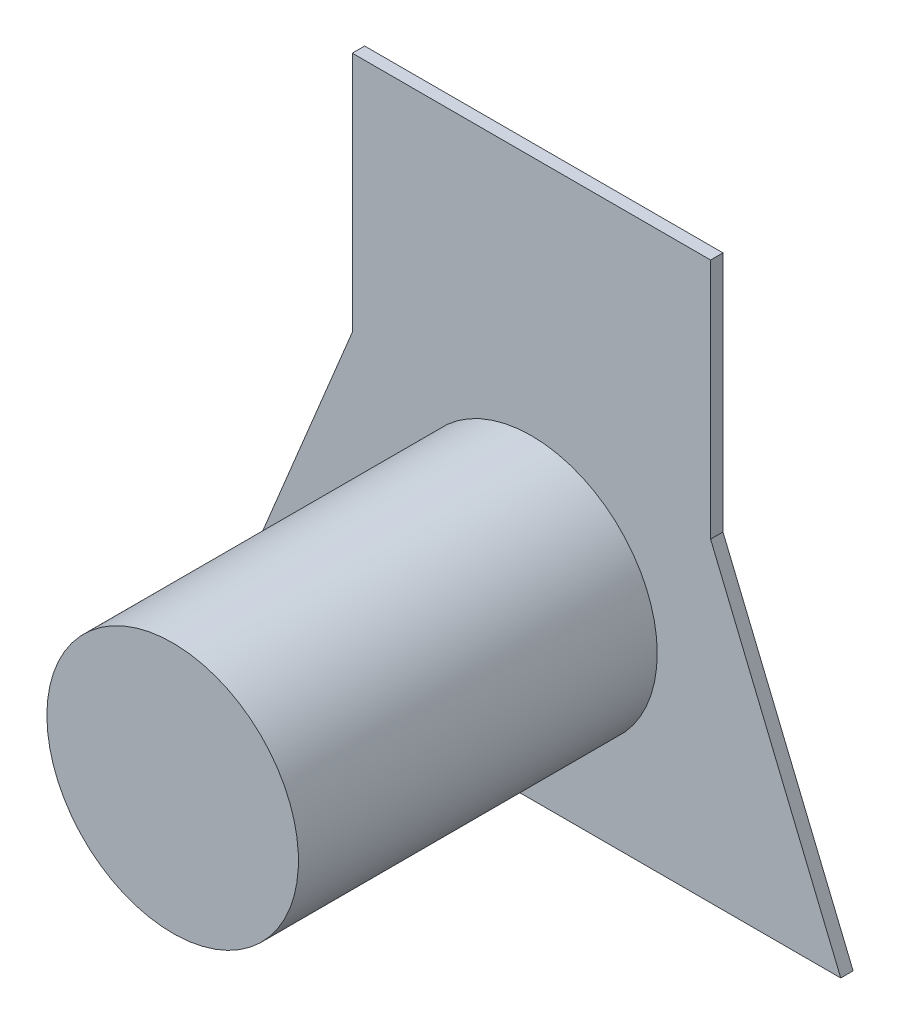
ISO-10303-21;
HEADER;
FILE_DESCRIPTION(('STEP AP214'),'2;1');
FILE_NAME('part.step','',(''),(''),'','','');
FILE_SCHEMA(('AUTOMOTIVE_DESIGN { 1 0 10303 214 1 1 1 1 }'));
ENDSEC;
DATA;
#1=APPLICATION_CONTEXT('core data for automotive mechanical design processes');
#2=APPLICATION_PROTOCOL_DEFINITION('international standard','automotive_design',2000,#1);
#3=PRODUCT_CONTEXT('',#1,'mechanical');
#4=PRODUCT('Part','Part','',(#3));
#5=PRODUCT_RELATED_PRODUCT_CATEGORY('part','',(#4));
#6=PRODUCT_DEFINITION_FORMATION('','',#4);
#7=PRODUCT_DEFINITION_CONTEXT('part definition',#1,'design');
#8=PRODUCT_DEFINITION('design','',#6,#7);
#9=PRODUCT_DEFINITION_SHAPE('','',#8);
#10=(LENGTH_UNIT() NAMED_UNIT(*) SI_UNIT(.MILLI.,.METRE.));
#11=(NAMED_UNIT(*) PLANE_ANGLE_UNIT() SI_UNIT($,.RADIAN.));
#12=(NAMED_UNIT(*) SI_UNIT($,.STERADIAN.) SOLID_ANGLE_UNIT());
#13=UNCERTAINTY_MEASURE_WITH_UNIT(LENGTH_MEASURE(1.E-05),#10,'distance_accuracy_value','');
#14=(GEOMETRIC_REPRESENTATION_CONTEXT(3) GLOBAL_UNCERTAINTY_ASSIGNED_CONTEXT((#13)) GLOBAL_UNIT_ASSIGNED_CONTEXT((#10,
#11,#12)) REPRESENTATION_CONTEXT('',''));
#15=CARTESIAN_POINT('',(0.,0.,0.));
#16=DIRECTION('',(0.,0.,1.));
#17=DIRECTION('',(1.,0.,0.));
#18=AXIS2_PLACEMENT_3D('',#15,#16,#17);
#19=CARTESIAN_POINT('',(-50.,0.,2.));
#20=DIRECTION('',(0.,1.,0.));
#21=DIRECTION('',(-1.,0.,0.));
#22=AXIS2_PLACEMENT_3D('',#19,#20,#21);
#23=PLANE('',#22);
#24=DIRECTION('',(1.,0.,0.));
#25=VECTOR('',#24,1.);
#26=CARTESIAN_POINT('',(-50.,0.,0.));
#27=LINE('',#26,#25);
#28=CARTESIAN_POINT('',(-50.,0.,0.));
#29=VERTEX_POINT('',#28);
#30=CARTESIAN_POINT('',(50.,0.,0.));
#31=VERTEX_POINT('',#30);
#32=EDGE_CURVE('E121',#29,#31,#27,.T.);
#33=ORIENTED_EDGE('',*,*,#32,.T.);
#34=DIRECTION('',(0.,0.,-1.));
#35=VECTOR('',#34,1.);
#36=CARTESIAN_POINT('',(50.,0.,2.));
#37=LINE('',#36,#35);
#38=CARTESIAN_POINT('',(50.,0.,2.));
#39=VERTEX_POINT('',#38);
#40=EDGE_CURVE('E38',#39,#31,#37,.T.);
#41=ORIENTED_EDGE('',*,*,#40,.F.);
#42=DIRECTION('',(1.,0.,0.));
#43=VECTOR('',#42,1.);
#44=CARTESIAN_POINT('',(-50.,0.,2.));
#45=LINE('',#44,#43);
#46=CARTESIAN_POINT('',(-50.,0.,2.));
#47=VERTEX_POINT('',#46);
#48=EDGE_CURVE('E132',#47,#39,#45,.T.);
#49=ORIENTED_EDGE('',*,*,#48,.F.);
#50=DIRECTION('',(0.,0.,-1.));
#51=VECTOR('',#50,1.);
#52=CARTESIAN_POINT('',(-50.,0.,2.));
#53=LINE('',#52,#51);
#54=EDGE_CURVE('E117',#47,#29,#53,.T.);
#55=ORIENTED_EDGE('',*,*,#54,.T.);
#56=EDGE_LOOP('',(#33,#41,#49,#55));
#57=FACE_BOUND('',#56,.T.);
#58=ADVANCED_FACE('F35',(#57),#23,.F.);
#59=CARTESIAN_POINT('',(50.,0.,2.));
#60=DIRECTION('',(-0.924222874007874,-0.381853478654608,0.));
#61=DIRECTION('',(0.381853478654608,-0.924222874007874,0.));
#62=AXIS2_PLACEMENT_3D('',#59,#60,#61);
#63=PLANE('',#62);
#64=DIRECTION('',(-0.381853478654608,0.924222874007874,0.));
#65=VECTOR('',#64,1.);
#66=CARTESIAN_POINT('',(50.,0.,0.));
#67=LINE('',#66,#65);
#68=CARTESIAN_POINT('',(28.9609493475839,50.9220759985832,0.));
#69=VERTEX_POINT('',#68);
#70=EDGE_CURVE('E124',#31,#69,#67,.T.);
#71=ORIENTED_EDGE('',*,*,#70,.T.);
#72=DIRECTION('',(0.,0.,-1.));
#73=VECTOR('',#72,1.);
#74=CARTESIAN_POINT('',(28.9609493475839,50.9220759985832,2.));
#75=LINE('',#74,#73);
#76=CARTESIAN_POINT('',(28.9609493475839,50.9220759985832,2.));
#77=VERTEX_POINT('',#76);
#78=EDGE_CURVE('E135',#77,#69,#75,.T.);
#79=ORIENTED_EDGE('',*,*,#78,.F.);
#80=DIRECTION('',(-0.381853478654608,0.924222874007874,0.));
#81=VECTOR('',#80,1.);
#82=CARTESIAN_POINT('',(50.,0.,2.));
#83=LINE('',#82,#81);
#84=EDGE_CURVE('E90',#39,#77,#83,.T.);
#85=ORIENTED_EDGE('',*,*,#84,.F.);
#86=ORIENTED_EDGE('',*,*,#40,.T.);
#87=EDGE_LOOP('',(#71,#79,#85,#86));
#88=FACE_BOUND('',#87,.T.);
#89=ADVANCED_FACE('F140',(#88),#63,.F.);
#90=CARTESIAN_POINT('',(28.9609493475839,50.9220759985832,2.));
#91=DIRECTION('',(-1.,0.,0.));
#92=DIRECTION('',(0.,0.,1.));
#93=AXIS2_PLACEMENT_3D('',#90,#91,#92);
#94=PLANE('',#93);
#95=DIRECTION('',(0.,1.,0.));
#96=VECTOR('',#95,1.);
#97=CARTESIAN_POINT('',(28.9609493475839,50.9220759985832,0.));
#98=LINE('',#97,#96);
#99=CARTESIAN_POINT('',(28.9609493475839,90.,0.));
#100=VERTEX_POINT('',#99);
#101=EDGE_CURVE('E127',#69,#100,#98,.T.);
#102=ORIENTED_EDGE('',*,*,#101,.T.);
#103=DIRECTION('',(0.,0.,-1.));
#104=VECTOR('',#103,1.);
#105=CARTESIAN_POINT('',(28.9609493475839,90.,2.));
#106=LINE('',#105,#104);
#107=CARTESIAN_POINT('',(28.9609493475839,90.,2.));
#108=VERTEX_POINT('',#107);
#109=EDGE_CURVE('E112',#108,#100,#106,.T.);
#110=ORIENTED_EDGE('',*,*,#109,.F.);
#111=DIRECTION('',(0.,1.,0.));
#112=VECTOR('',#111,1.);
#113=CARTESIAN_POINT('',(28.9609493475839,50.9220759985832,2.));
#114=LINE('',#113,#112);
#115=EDGE_CURVE('E103',#77,#108,#114,.T.);
#116=ORIENTED_EDGE('',*,*,#115,.F.);
#117=ORIENTED_EDGE('',*,*,#78,.T.);
#118=EDGE_LOOP('',(#102,#110,#116,#117));
#119=FACE_BOUND('',#118,.T.);
#120=ADVANCED_FACE('F146',(#119),#94,.F.);
#121=CARTESIAN_POINT('',(-28.9609493475839,90.,2.));
#122=DIRECTION('',(0.,-1.,0.));
#123=DIRECTION('',(0.,0.,-1.));
#124=AXIS2_PLACEMENT_3D('',#121,#122,#123);
#125=PLANE('',#124);
#126=DIRECTION('',(-1.,0.,0.));
#127=VECTOR('',#126,1.);
#128=CARTESIAN_POINT('',(-28.9609493475839,90.,0.));
#129=LINE('',#128,#127);
#130=CARTESIAN_POINT('',(-28.9609493475839,90.,0.));
#131=VERTEX_POINT('',#130);
#132=EDGE_CURVE('E111',#100,#131,#129,.T.);
#133=ORIENTED_EDGE('',*,*,#132,.T.);
#134=DIRECTION('',(0.,0.,-1.));
#135=VECTOR('',#134,1.);
#136=CARTESIAN_POINT('',(-28.9609493475839,90.,2.));
#137=LINE('',#136,#135);
#138=CARTESIAN_POINT('',(-28.9609493475839,90.,2.));
#139=VERTEX_POINT('',#138);
#140=EDGE_CURVE('E108',#139,#131,#137,.T.);
#141=ORIENTED_EDGE('',*,*,#140,.F.);
#142=DIRECTION('',(-1.,0.,0.));
#143=VECTOR('',#142,1.);
#144=CARTESIAN_POINT('',(-28.9609493475839,90.,2.));
#145=LINE('',#144,#143);
#146=EDGE_CURVE('E97',#108,#139,#145,.T.);
#147=ORIENTED_EDGE('',*,*,#146,.F.);
#148=ORIENTED_EDGE('',*,*,#109,.T.);
#149=EDGE_LOOP('',(#133,#141,#147,#148));
#150=FACE_BOUND('',#149,.T.);
#151=ADVANCED_FACE('F109',(#150),#125,.F.);
#152=CARTESIAN_POINT('',(-28.9609493475839,50.9220759985832,2.));
#153=DIRECTION('',(1.,0.,0.));
#154=DIRECTION('',(0.,0.,-1.));
#155=AXIS2_PLACEMENT_3D('',#152,#153,#154);
#156=PLANE('',#155);
#157=DIRECTION('',(0.,-1.,0.));
#158=VECTOR('',#157,1.);
#159=CARTESIAN_POINT('',(-28.9609493475839,50.9220759985832,0.));
#160=LINE('',#159,#158);
#161=CARTESIAN_POINT('',(-28.9609493475839,50.9220759985832,0.));
#162=VERTEX_POINT('',#161);
#163=EDGE_CURVE('E75',#131,#162,#160,.T.);
#164=ORIENTED_EDGE('',*,*,#163,.T.);
#165=DIRECTION('',(0.,0.,-1.));
#166=VECTOR('',#165,1.);
#167=CARTESIAN_POINT('',(-28.9609493475839,50.9220759985832,2.));
#168=LINE('',#167,#166);
#169=CARTESIAN_POINT('',(-28.9609493475839,50.9220759985832,2.));
#170=VERTEX_POINT('',#169);
#171=EDGE_CURVE('E113',#170,#162,#168,.T.);
#172=ORIENTED_EDGE('',*,*,#171,.F.);
#173=DIRECTION('',(0.,-1.,0.));
#174=VECTOR('',#173,1.);
#175=CARTESIAN_POINT('',(-28.9609493475839,50.9220759985832,2.));
#176=LINE('',#175,#174);
#177=EDGE_CURVE('E101',#139,#170,#176,.T.);
#178=ORIENTED_EDGE('',*,*,#177,.F.);
#179=ORIENTED_EDGE('',*,*,#140,.T.);
#180=EDGE_LOOP('',(#164,#172,#178,#179));
#181=FACE_BOUND('',#180,.T.);
#182=ADVANCED_FACE('F115',(#181),#156,.F.);
#183=CARTESIAN_POINT('',(-50.,0.,2.));
#184=DIRECTION('',(0.924222874007875,-0.381853478654607,0.));
#185=DIRECTION('',(0.381853478654607,0.924222874007875,0.));
#186=AXIS2_PLACEMENT_3D('',#183,#184,#185);
#187=PLANE('',#186);
#188=DIRECTION('',(-0.381853478654607,-0.924222874007875,0.));
#189=VECTOR('',#188,1.);
#190=CARTESIAN_POINT('',(-50.,0.,0.));
#191=LINE('',#190,#189);
#192=EDGE_CURVE('E81',#162,#29,#191,.T.);
#193=ORIENTED_EDGE('',*,*,#192,.T.);
#194=ORIENTED_EDGE('',*,*,#54,.F.);
#195=DIRECTION('',(-0.381853478654607,-0.924222874007875,0.));
#196=VECTOR('',#195,1.);
#197=CARTESIAN_POINT('',(-50.,0.,2.));
#198=LINE('',#197,#196);
#199=EDGE_CURVE('E52',#170,#47,#198,.T.);
#200=ORIENTED_EDGE('',*,*,#199,.F.);
#201=ORIENTED_EDGE('',*,*,#171,.T.);
#202=EDGE_LOOP('',(#193,#194,#200,#201));
#203=FACE_BOUND('',#202,.T.);
#204=ADVANCED_FACE('F176',(#203),#187,.F.);
#205=CARTESIAN_POINT('',(0.,0.,2.));
#206=DIRECTION('',(0.,0.,1.));
#207=DIRECTION('',(1.,0.,0.));
#208=AXIS2_PLACEMENT_3D('',#205,#206,#207);
#209=PLANE('',#208);
#210=CARTESIAN_POINT('',(0.,30.5961515708933,2.));
#211=DIRECTION('',(0.,0.,1.));
#212=DIRECTION('',(1.,0.,0.));
#213=AXIS2_PLACEMENT_3D('',#210,#211,#212);
#214=CIRCLE('',#213,20.3335184054506);
#215=CARTESIAN_POINT('',(20.3335184054506,30.5961515708933,2.));
#216=VERTEX_POINT('',#215);
#217=EDGE_CURVE('E11',#216,#216,#214,.T.);
#218=ORIENTED_EDGE('',*,*,#217,.F.);
#219=EDGE_LOOP('',(#218));
#220=FACE_BOUND('',#219,.T.);
#221=ORIENTED_EDGE('',*,*,#48,.T.);
#222=ORIENTED_EDGE('',*,*,#84,.T.);
#223=ORIENTED_EDGE('',*,*,#115,.T.);
#224=ORIENTED_EDGE('',*,*,#146,.T.);
#225=ORIENTED_EDGE('',*,*,#177,.T.);
#226=ORIENTED_EDGE('',*,*,#199,.T.);
#227=EDGE_LOOP('',(#221,#222,#223,#224,#225,#226));
#228=FACE_BOUND('',#227,.T.);
#229=ADVANCED_FACE('F99',(#220,#228),#209,.T.);
#230=CARTESIAN_POINT('',(0.,0.,0.));
#231=DIRECTION('',(0.,0.,1.));
#232=DIRECTION('',(1.,0.,0.));
#233=AXIS2_PLACEMENT_3D('',#230,#231,#232);
#234=PLANE('',#233);
#235=ORIENTED_EDGE('',*,*,#32,.F.);
#236=ORIENTED_EDGE('',*,*,#192,.F.);
#237=ORIENTED_EDGE('',*,*,#163,.F.);
#238=ORIENTED_EDGE('',*,*,#132,.F.);
#239=ORIENTED_EDGE('',*,*,#101,.F.);
#240=ORIENTED_EDGE('',*,*,#70,.F.);
#241=EDGE_LOOP('',(#235,#236,#237,#238,#239,#240));
#242=FACE_BOUND('',#241,.T.);
#243=ADVANCED_FACE('F145',(#242),#234,.F.);
#244=CARTESIAN_POINT('',(0.,30.5961515708933,60.));
#245=DIRECTION('',(0.,0.,-1.));
#246=DIRECTION('',(-1.,0.,0.));
#247=AXIS2_PLACEMENT_3D('',#244,#245,#246);
#248=CYLINDRICAL_SURFACE('',#247,20.3335184054506);
#249=ORIENTED_EDGE('',*,*,#217,.T.);
#250=EDGE_LOOP('',(#249));
#251=FACE_BOUND('',#250,.T.);
#252=CARTESIAN_POINT('',(0.,30.5961515708933,60.));
#253=DIRECTION('',(0.,0.,-1.));
#254=DIRECTION('',(-1.,0.,0.));
#255=AXIS2_PLACEMENT_3D('',#252,#253,#254);
#256=CIRCLE('',#255,20.3335184054506);
#257=CARTESIAN_POINT('',(-20.3335184054506,30.5961515708933,60.));
#258=VERTEX_POINT('',#257);
#259=EDGE_CURVE('E125',#258,#258,#256,.T.);
#260=ORIENTED_EDGE('',*,*,#259,.T.);
#261=EDGE_LOOP('',(#260));
#262=FACE_BOUND('',#261,.T.);
#263=ADVANCED_FACE('F153',(#251,#262),#248,.T.);
#264=CARTESIAN_POINT('',(0.,30.5961515708933,60.));
#265=DIRECTION('',(0.,0.,-1.));
#266=DIRECTION('',(-1.,0.,0.));
#267=AXIS2_PLACEMENT_3D('',#264,#265,#266);
#268=PLANE('',#267);
#269=ORIENTED_EDGE('',*,*,#259,.F.);
#270=EDGE_LOOP('',(#269));
#271=FACE_BOUND('',#270,.T.);
#272=ADVANCED_FACE('F155',(#271),#268,.F.);
#273=CLOSED_SHELL('',(#58,#89,#120,#151,#182,#204,#229,#243,#263,#272));
#274=MANIFOLD_SOLID_BREP('B2',#273);
#275=ADVANCED_BREP_SHAPE_REPRESENTATION('',(#18,#274),#14);
#276=SHAPE_DEFINITION_REPRESENTATION(#9,#275);
ENDSEC;
END-ISO-10303-21;
